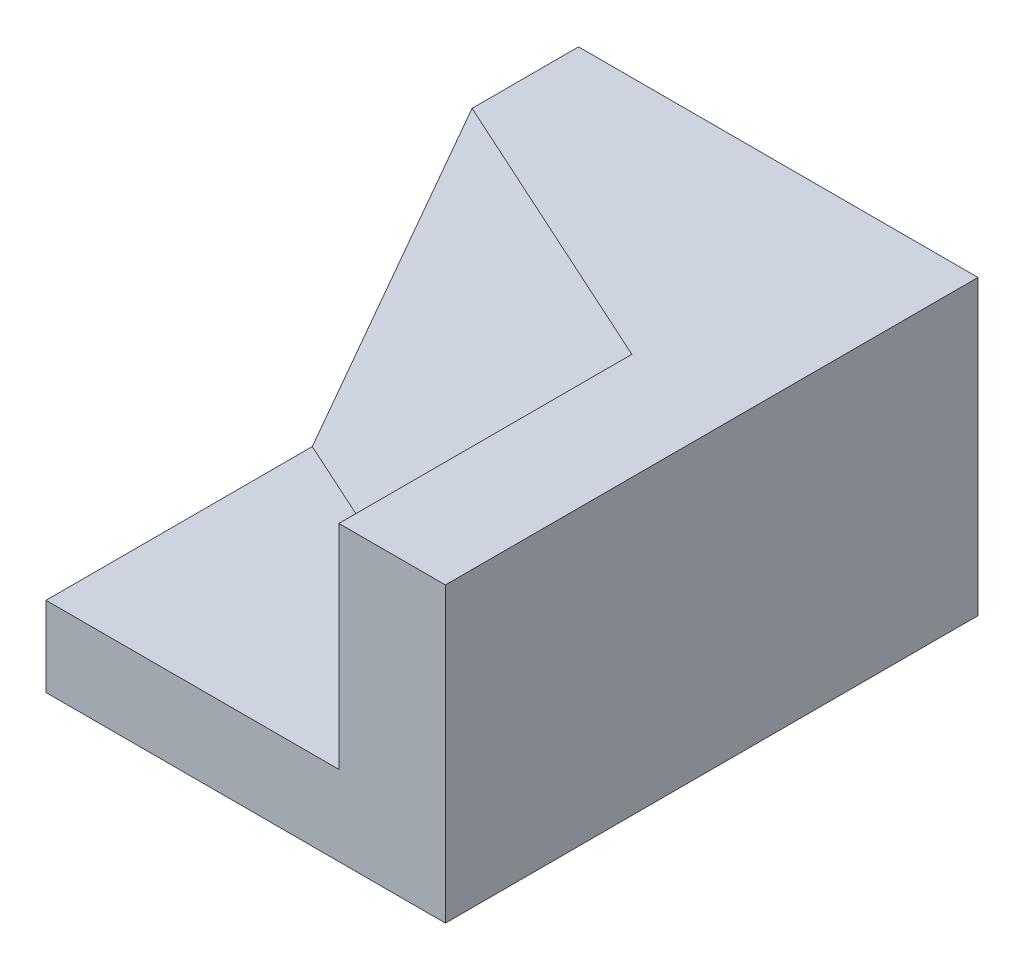
ISO-10303-21;
HEADER;
FILE_DESCRIPTION(('STEP AP214'),'2;1');
FILE_NAME('part.step','',(''),(''),'','','');
FILE_SCHEMA(('AUTOMOTIVE_DESIGN { 1 0 10303 214 1 1 1 1 }'));
ENDSEC;
DATA;
#1=APPLICATION_CONTEXT('core data for automotive mechanical design processes');
#2=APPLICATION_PROTOCOL_DEFINITION('international standard','automotive_design',2000,#1);
#3=PRODUCT_CONTEXT('',#1,'mechanical');
#4=PRODUCT('Part','Part','',(#3));
#5=PRODUCT_RELATED_PRODUCT_CATEGORY('part','',(#4));
#6=PRODUCT_DEFINITION_FORMATION('','',#4);
#7=PRODUCT_DEFINITION_CONTEXT('part definition',#1,'design');
#8=PRODUCT_DEFINITION('design','',#6,#7);
#9=PRODUCT_DEFINITION_SHAPE('','',#8);
#10=(LENGTH_UNIT() NAMED_UNIT(*) SI_UNIT(.MILLI.,.METRE.));
#11=(NAMED_UNIT(*) PLANE_ANGLE_UNIT() SI_UNIT($,.RADIAN.));
#12=(NAMED_UNIT(*) SI_UNIT($,.STERADIAN.) SOLID_ANGLE_UNIT());
#13=UNCERTAINTY_MEASURE_WITH_UNIT(LENGTH_MEASURE(1.E-05),#10,'distance_accuracy_value','');
#14=(GEOMETRIC_REPRESENTATION_CONTEXT(3) GLOBAL_UNCERTAINTY_ASSIGNED_CONTEXT((#13)) GLOBAL_UNIT_ASSIGNED_CONTEXT((#10,
#11,#12)) REPRESENTATION_CONTEXT('',''));
#15=CARTESIAN_POINT('',(0.,0.,0.));
#16=DIRECTION('',(0.,0.,1.));
#17=DIRECTION('',(1.,0.,0.));
#18=AXIS2_PLACEMENT_3D('',#15,#16,#17);
#19=CARTESIAN_POINT('',(-20.,55.,100.));
#20=DIRECTION('',(0.,-1.,0.));
#21=DIRECTION('',(0.,0.,-1.));
#22=AXIS2_PLACEMENT_3D('',#19,#20,#21);
#23=PLANE('',#22);
#24=DIRECTION('',(-0.910366477462605,0.,-0.413802944301184));
#25=VECTOR('',#24,1.);
#26=CARTESIAN_POINT('',(-20.,55.,45.));
#27=LINE('',#26,#25);
#28=CARTESIAN_POINT('',(-20.,55.,45.));
#29=VERTEX_POINT('',#28);
#30=CARTESIAN_POINT('',(-75.,55.,20.));
#31=VERTEX_POINT('',#30);
#32=EDGE_CURVE('E166',#29,#31,#27,.T.);
#33=ORIENTED_EDGE('',*,*,#32,.F.);
#34=DIRECTION('',(0.,0.,-1.));
#35=VECTOR('',#34,1.);
#36=CARTESIAN_POINT('',(-20.,55.,100.));
#37=LINE('',#36,#35);
#38=CARTESIAN_POINT('',(-20.,55.,100.));
#39=VERTEX_POINT('',#38);
#40=EDGE_CURVE('E53',#39,#29,#37,.T.);
#41=ORIENTED_EDGE('',*,*,#40,.F.);
#42=DIRECTION('',(-1.,0.,0.));
#43=VECTOR('',#42,1.);
#44=CARTESIAN_POINT('',(-20.,55.,100.));
#45=LINE('',#44,#43);
#46=CARTESIAN_POINT('',(0.,55.,100.));
#47=VERTEX_POINT('',#46);
#48=EDGE_CURVE('E90',#47,#39,#45,.T.);
#49=ORIENTED_EDGE('',*,*,#48,.F.);
#50=DIRECTION('',(0.,0.,-1.));
#51=VECTOR('',#50,1.);
#52=CARTESIAN_POINT('',(0.,55.,100.));
#53=LINE('',#52,#51);
#54=CARTESIAN_POINT('',(0.,55.,0.));
#55=VERTEX_POINT('',#54);
#56=EDGE_CURVE('E11',#47,#55,#53,.T.);
#57=ORIENTED_EDGE('',*,*,#56,.T.);
#58=DIRECTION('',(-1.,0.,0.));
#59=VECTOR('',#58,1.);
#60=CARTESIAN_POINT('',(-20.,55.,0.));
#61=LINE('',#60,#59);
#62=CARTESIAN_POINT('',(-75.,55.,0.));
#63=VERTEX_POINT('',#62);
#64=EDGE_CURVE('E136',#55,#63,#61,.T.);
#65=ORIENTED_EDGE('',*,*,#64,.T.);
#66=DIRECTION('',(0.,0.,1.));
#67=VECTOR('',#66,1.);
#68=CARTESIAN_POINT('',(-75.,55.,0.));
#69=LINE('',#68,#67);
#70=EDGE_CURVE('E137',#63,#31,#69,.T.);
#71=ORIENTED_EDGE('',*,*,#70,.T.);
#72=EDGE_LOOP('',(#33,#41,#49,#57,#65,#71));
#73=FACE_BOUND('',#72,.T.);
#74=ADVANCED_FACE('F43',(#73),#23,.F.);
#75=CARTESIAN_POINT('',(-75.,0.,100.));
#76=DIRECTION('',(1.,0.,0.));
#77=DIRECTION('',(0.,0.,-1.));
#78=AXIS2_PLACEMENT_3D('',#75,#76,#77);
#79=PLANE('',#78);
#80=DIRECTION('',(0.,0.,-1.));
#81=VECTOR('',#80,1.);
#82=CARTESIAN_POINT('',(-75.,15.,100.));
#83=LINE('',#82,#81);
#84=CARTESIAN_POINT('',(-75.,15.,100.));
#85=VERTEX_POINT('',#84);
#86=CARTESIAN_POINT('',(-75.,15.,50.));
#87=VERTEX_POINT('',#86);
#88=EDGE_CURVE('E113',#85,#87,#83,.T.);
#89=ORIENTED_EDGE('',*,*,#88,.T.);
#90=DIRECTION('',(0.,-0.8,0.6));
#91=VECTOR('',#90,1.);
#92=CARTESIAN_POINT('',(-75.,55.,20.));
#93=LINE('',#92,#91);
#94=EDGE_CURVE('E171',#31,#87,#93,.T.);
#95=ORIENTED_EDGE('',*,*,#94,.F.);
#96=ORIENTED_EDGE('',*,*,#70,.F.);
#97=DIRECTION('',(0.,-1.,0.));
#98=VECTOR('',#97,1.);
#99=CARTESIAN_POINT('',(-75.,0.,0.));
#100=LINE('',#99,#98);
#101=CARTESIAN_POINT('',(-75.,0.,0.));
#102=VERTEX_POINT('',#101);
#103=EDGE_CURVE('E76',#63,#102,#100,.T.);
#104=ORIENTED_EDGE('',*,*,#103,.T.);
#105=DIRECTION('',(0.,0.,-1.));
#106=VECTOR('',#105,1.);
#107=CARTESIAN_POINT('',(-75.,0.,100.));
#108=LINE('',#107,#106);
#109=CARTESIAN_POINT('',(-75.,0.,100.));
#110=VERTEX_POINT('',#109);
#111=EDGE_CURVE('E122',#110,#102,#108,.T.);
#112=ORIENTED_EDGE('',*,*,#111,.F.);
#113=DIRECTION('',(0.,-1.,0.));
#114=VECTOR('',#113,1.);
#115=CARTESIAN_POINT('',(-75.,0.,100.));
#116=LINE('',#115,#114);
#117=EDGE_CURVE('E103',#85,#110,#116,.T.);
#118=ORIENTED_EDGE('',*,*,#117,.F.);
#119=EDGE_LOOP('',(#89,#95,#96,#104,#112,#118));
#120=FACE_BOUND('',#119,.T.);
#121=ADVANCED_FACE('F124',(#120),#79,.F.);
#122=CARTESIAN_POINT('',(0.,55.,100.));
#123=DIRECTION('',(-1.,0.,0.));
#124=DIRECTION('',(0.,-1.,0.));
#125=AXIS2_PLACEMENT_3D('',#122,#123,#124);
#126=PLANE('',#125);
#127=DIRECTION('',(0.,1.,0.));
#128=VECTOR('',#127,1.);
#129=CARTESIAN_POINT('',(0.,55.,0.));
#130=LINE('',#129,#128);
#131=CARTESIAN_POINT('',(0.,0.,0.));
#132=VERTEX_POINT('',#131);
#133=EDGE_CURVE('E132',#132,#55,#130,.T.);
#134=ORIENTED_EDGE('',*,*,#133,.T.);
#135=ORIENTED_EDGE('',*,*,#56,.F.);
#136=DIRECTION('',(0.,1.,0.));
#137=VECTOR('',#136,1.);
#138=CARTESIAN_POINT('',(0.,55.,100.));
#139=LINE('',#138,#137);
#140=CARTESIAN_POINT('',(0.,0.,100.));
#141=VERTEX_POINT('',#140);
#142=EDGE_CURVE('E145',#141,#47,#139,.T.);
#143=ORIENTED_EDGE('',*,*,#142,.F.);
#144=DIRECTION('',(0.,0.,-1.));
#145=VECTOR('',#144,1.);
#146=CARTESIAN_POINT('',(0.,0.,100.));
#147=LINE('',#146,#145);
#148=EDGE_CURVE('E128',#141,#132,#147,.T.);
#149=ORIENTED_EDGE('',*,*,#148,.T.);
#150=EDGE_LOOP('',(#134,#135,#143,#149));
#151=FACE_BOUND('',#150,.T.);
#152=ADVANCED_FACE('F45',(#151),#126,.F.);
#153=CARTESIAN_POINT('',(-20.,15.,100.));
#154=DIRECTION('',(1.,0.,0.));
#155=DIRECTION('',(0.,1.,0.));
#156=AXIS2_PLACEMENT_3D('',#153,#154,#155);
#157=PLANE('',#156);
#158=ORIENTED_EDGE('',*,*,#40,.T.);
#159=DIRECTION('',(0.,0.8,-0.6));
#160=VECTOR('',#159,1.);
#161=CARTESIAN_POINT('',(-20.,15.,75.));
#162=LINE('',#161,#160);
#163=CARTESIAN_POINT('',(-20.,15.,75.));
#164=VERTEX_POINT('',#163);
#165=EDGE_CURVE('E159',#164,#29,#162,.T.);
#166=ORIENTED_EDGE('',*,*,#165,.F.);
#167=DIRECTION('',(0.,0.,-1.));
#168=VECTOR('',#167,1.);
#169=CARTESIAN_POINT('',(-20.,15.,100.));
#170=LINE('',#169,#168);
#171=CARTESIAN_POINT('',(-20.,15.,100.));
#172=VERTEX_POINT('',#171);
#173=EDGE_CURVE('E121',#172,#164,#170,.T.);
#174=ORIENTED_EDGE('',*,*,#173,.F.);
#175=DIRECTION('',(0.,-1.,0.));
#176=VECTOR('',#175,1.);
#177=CARTESIAN_POINT('',(-20.,15.,100.));
#178=LINE('',#177,#176);
#179=EDGE_CURVE('E105',#39,#172,#178,.T.);
#180=ORIENTED_EDGE('',*,*,#179,.F.);
#181=EDGE_LOOP('',(#158,#166,#174,#180));
#182=FACE_BOUND('',#181,.T.);
#183=ADVANCED_FACE('F157',(#182),#157,.F.);
#184=CARTESIAN_POINT('',(-75.,15.,100.));
#185=DIRECTION('',(0.,-1.,0.));
#186=DIRECTION('',(0.,0.,-1.));
#187=AXIS2_PLACEMENT_3D('',#184,#185,#186);
#188=PLANE('',#187);
#189=ORIENTED_EDGE('',*,*,#173,.T.);
#190=DIRECTION('',(0.910366477462605,0.,0.413802944301184));
#191=VECTOR('',#190,1.);
#192=CARTESIAN_POINT('',(-75.,15.,50.));
#193=LINE('',#192,#191);
#194=EDGE_CURVE('E117',#87,#164,#193,.T.);
#195=ORIENTED_EDGE('',*,*,#194,.F.);
#196=ORIENTED_EDGE('',*,*,#88,.F.);
#197=DIRECTION('',(-1.,0.,0.));
#198=VECTOR('',#197,1.);
#199=CARTESIAN_POINT('',(-75.,15.,100.));
#200=LINE('',#199,#198);
#201=EDGE_CURVE('E99',#172,#85,#200,.T.);
#202=ORIENTED_EDGE('',*,*,#201,.F.);
#203=EDGE_LOOP('',(#189,#195,#196,#202));
#204=FACE_BOUND('',#203,.T.);
#205=ADVANCED_FACE('F114',(#204),#188,.F.);
#206=CARTESIAN_POINT('',(0.,0.,100.));
#207=DIRECTION('',(0.,1.,0.));
#208=DIRECTION('',(0.,0.,1.));
#209=AXIS2_PLACEMENT_3D('',#206,#207,#208);
#210=PLANE('',#209);
#211=DIRECTION('',(1.,0.,0.));
#212=VECTOR('',#211,1.);
#213=CARTESIAN_POINT('',(0.,0.,0.));
#214=LINE('',#213,#212);
#215=EDGE_CURVE('E82',#102,#132,#214,.T.);
#216=ORIENTED_EDGE('',*,*,#215,.T.);
#217=ORIENTED_EDGE('',*,*,#148,.F.);
#218=DIRECTION('',(1.,0.,0.));
#219=VECTOR('',#218,1.);
#220=CARTESIAN_POINT('',(0.,0.,100.));
#221=LINE('',#220,#219);
#222=EDGE_CURVE('E61',#110,#141,#221,.T.);
#223=ORIENTED_EDGE('',*,*,#222,.F.);
#224=ORIENTED_EDGE('',*,*,#111,.T.);
#225=EDGE_LOOP('',(#216,#217,#223,#224));
#226=FACE_BOUND('',#225,.T.);
#227=ADVANCED_FACE('F199',(#226),#210,.F.);
#228=CARTESIAN_POINT('',(0.,0.,100.));
#229=DIRECTION('',(0.,0.,-1.));
#230=DIRECTION('',(-1.,0.,0.));
#231=AXIS2_PLACEMENT_3D('',#228,#229,#230);
#232=PLANE('',#231);
#233=ORIENTED_EDGE('',*,*,#142,.T.);
#234=ORIENTED_EDGE('',*,*,#48,.T.);
#235=ORIENTED_EDGE('',*,*,#179,.T.);
#236=ORIENTED_EDGE('',*,*,#201,.T.);
#237=ORIENTED_EDGE('',*,*,#117,.T.);
#238=ORIENTED_EDGE('',*,*,#222,.T.);
#239=EDGE_LOOP('',(#233,#234,#235,#236,#237,#238));
#240=FACE_BOUND('',#239,.T.);
#241=ADVANCED_FACE('F101',(#240),#232,.F.);
#242=CARTESIAN_POINT('',(0.,0.,0.));
#243=DIRECTION('',(0.,0.,-1.));
#244=DIRECTION('',(-1.,0.,0.));
#245=AXIS2_PLACEMENT_3D('',#242,#243,#244);
#246=PLANE('',#245);
#247=ORIENTED_EDGE('',*,*,#133,.F.);
#248=ORIENTED_EDGE('',*,*,#215,.F.);
#249=ORIENTED_EDGE('',*,*,#103,.F.);
#250=ORIENTED_EDGE('',*,*,#64,.F.);
#251=EDGE_LOOP('',(#247,#248,#249,#250));
#252=FACE_BOUND('',#251,.T.);
#253=ADVANCED_FACE('F189',(#252),#246,.T.);
#254=CARTESIAN_POINT('',(-24.4963503649635,40.4189781021898,53.8919708029197));
#255=DIRECTION('',(-0.341743063086704,0.563876054093062,0.75183473879075));
#256=DIRECTION('',(0.,-0.8,0.6));
#257=AXIS2_PLACEMENT_3D('',#254,#255,#256);
#258=PLANE('',#257);
#259=ORIENTED_EDGE('',*,*,#165,.T.);
#260=ORIENTED_EDGE('',*,*,#32,.T.);
#261=ORIENTED_EDGE('',*,*,#94,.T.);
#262=ORIENTED_EDGE('',*,*,#194,.T.);
#263=EDGE_LOOP('',(#259,#260,#261,#262));
#264=FACE_BOUND('',#263,.T.);
#265=ADVANCED_FACE('F165',(#264),#258,.T.);
#266=CLOSED_SHELL('',(#74,#121,#152,#183,#205,#227,#241,#253,#265));
#267=MANIFOLD_SOLID_BREP('B2',#266);
#268=ADVANCED_BREP_SHAPE_REPRESENTATION('',(#18,#267),#14);
#269=SHAPE_DEFINITION_REPRESENTATION(#9,#268);
ENDSEC;
END-ISO-10303-21;
